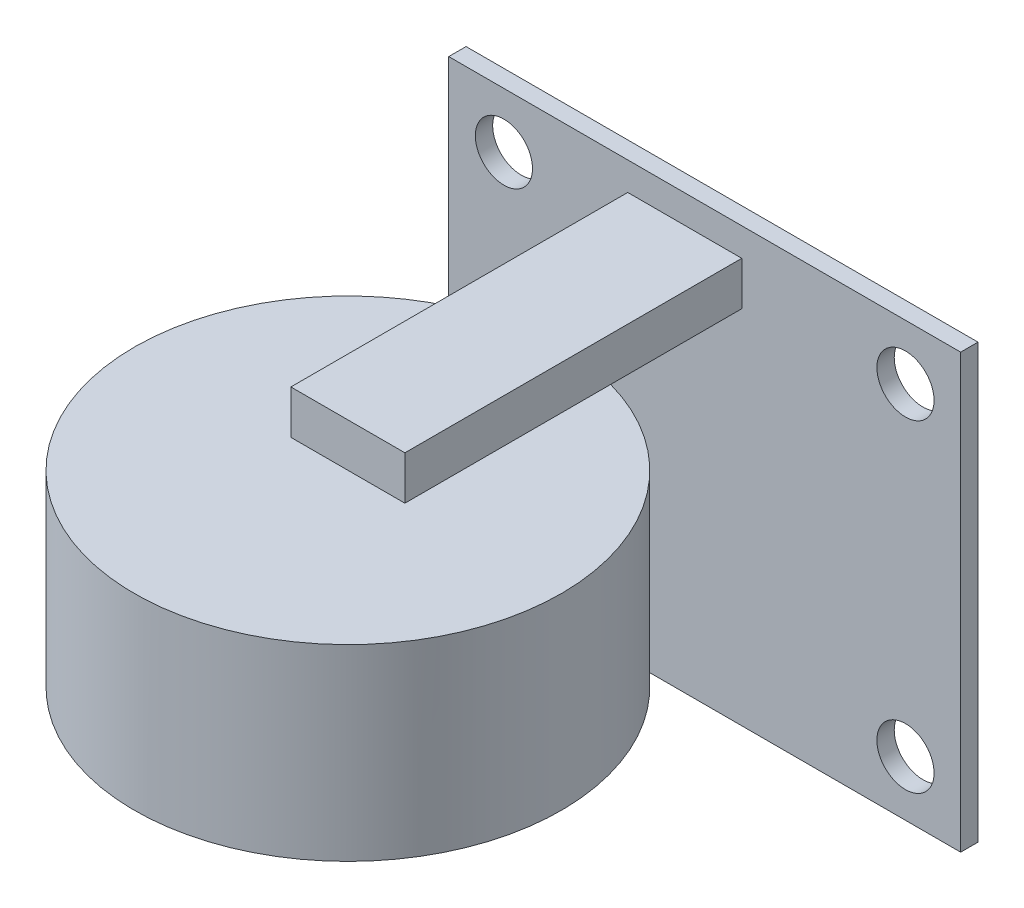
ISO-10303-21;
HEADER;
FILE_DESCRIPTION(('STEP AP214'),'2;1');
FILE_NAME('part.step','',(''),(''),'','','');
FILE_SCHEMA(('AUTOMOTIVE_DESIGN { 1 0 10303 214 1 1 1 1 }'));
ENDSEC;
DATA;
#1=APPLICATION_CONTEXT('core data for automotive mechanical design processes');
#2=APPLICATION_PROTOCOL_DEFINITION('international standard','automotive_design',2000,#1);
#3=PRODUCT_CONTEXT('',#1,'mechanical');
#4=PRODUCT('Part','Part','',(#3));
#5=PRODUCT_RELATED_PRODUCT_CATEGORY('part','',(#4));
#6=PRODUCT_DEFINITION_FORMATION('','',#4);
#7=PRODUCT_DEFINITION_CONTEXT('part definition',#1,'design');
#8=PRODUCT_DEFINITION('design','',#6,#7);
#9=PRODUCT_DEFINITION_SHAPE('','',#8);
#10=(LENGTH_UNIT() NAMED_UNIT(*) SI_UNIT(.MILLI.,.METRE.));
#11=(NAMED_UNIT(*) PLANE_ANGLE_UNIT() SI_UNIT($,.RADIAN.));
#12=(NAMED_UNIT(*) SI_UNIT($,.STERADIAN.) SOLID_ANGLE_UNIT());
#13=UNCERTAINTY_MEASURE_WITH_UNIT(LENGTH_MEASURE(1.E-05),#10,'distance_accuracy_value','');
#14=(GEOMETRIC_REPRESENTATION_CONTEXT(3) GLOBAL_UNCERTAINTY_ASSIGNED_CONTEXT((#13)) GLOBAL_UNIT_ASSIGNED_CONTEXT((#10,
#11,#12)) REPRESENTATION_CONTEXT('',''));
#15=CARTESIAN_POINT('',(0.,0.,0.));
#16=DIRECTION('',(0.,0.,1.));
#17=DIRECTION('',(1.,0.,0.));
#18=AXIS2_PLACEMENT_3D('',#15,#16,#17);
#19=CARTESIAN_POINT('',(15.7377658292148,31.756757303242,31.1404));
#20=DIRECTION('',(0.,1.,0.));
#21=DIRECTION('',(0.,0.,1.));
#22=AXIS2_PLACEMENT_3D('',#19,#20,#21);
#23=PLANE('',#22);
#24=CARTESIAN_POINT('',(20.7508458663312,31.756757303242,31.1404));
#25=DIRECTION('',(0.,-1.,0.));
#26=DIRECTION('',(0.,0.,-1.));
#27=AXIS2_PLACEMENT_3D('',#24,#25,#26);
#28=CIRCLE('',#27,18.7706);
#29=CARTESIAN_POINT('',(15.7377658292148,31.756757303242,13.0516064276949));
#30=VERTEX_POINT('',#29);
#31=CARTESIAN_POINT('',(25.7639259034477,31.756757303242,13.0516064276949));
#32=VERTEX_POINT('',#31);
#33=EDGE_CURVE('E106',#30,#32,#28,.T.);
#34=ORIENTED_EDGE('',*,*,#33,.F.);
#35=DIRECTION('',(0.,0.,-1.));
#36=VECTOR('',#35,1.);
#37=CARTESIAN_POINT('',(15.7377658292148,31.756757303242,31.1404));
#38=LINE('',#37,#36);
#39=CARTESIAN_POINT('',(15.7377658292148,31.756757303242,1.524));
#40=VERTEX_POINT('',#39);
#41=EDGE_CURVE('E47',#30,#40,#38,.T.);
#42=ORIENTED_EDGE('',*,*,#41,.T.);
#43=DIRECTION('',(1.,0.,0.));
#44=VECTOR('',#43,1.);
#45=CARTESIAN_POINT('',(15.7377658292148,31.756757303242,1.524));
#46=LINE('',#45,#44);
#47=CARTESIAN_POINT('',(25.7639259034477,31.756757303242,1.524));
#48=VERTEX_POINT('',#47);
#49=EDGE_CURVE('E118',#40,#48,#46,.T.);
#50=ORIENTED_EDGE('',*,*,#49,.T.);
#51=DIRECTION('',(0.,0.,-1.));
#52=VECTOR('',#51,1.);
#53=CARTESIAN_POINT('',(25.7639259034477,31.756757303242,31.1404));
#54=LINE('',#53,#52);
#55=EDGE_CURVE('E55',#32,#48,#54,.T.);
#56=ORIENTED_EDGE('',*,*,#55,.F.);
#57=EDGE_LOOP('',(#34,#42,#50,#56));
#58=FACE_BOUND('',#57,.T.);
#59=ADVANCED_FACE('F32',(#58),#23,.F.);
#60=CARTESIAN_POINT('',(0.,0.,1.524));
#61=DIRECTION('',(0.,0.,-1.));
#62=DIRECTION('',(-1.,0.,0.));
#63=AXIS2_PLACEMENT_3D('',#60,#61,#62);
#64=PLANE('',#63);
#65=CARTESIAN_POINT('',(40.1574,33.2232,1.524));
#66=DIRECTION('',(0.,0.,1.));
#67=DIRECTION('',(1.,0.,0.));
#68=AXIS2_PLACEMENT_3D('',#65,#66,#67);
#69=CIRCLE('',#68,2.5146);
#70=CARTESIAN_POINT('',(37.6428,33.2232,1.524));
#71=VERTEX_POINT('',#70);
#72=EDGE_CURVE('E130',#71,#71,#69,.T.);
#73=ORIENTED_EDGE('',*,*,#72,.F.);
#74=EDGE_LOOP('',(#73));
#75=FACE_BOUND('',#74,.T.);
#76=CARTESIAN_POINT('',(4.8514,4.8514,1.524));
#77=DIRECTION('',(0.,0.,1.));
#78=DIRECTION('',(1.,0.,0.));
#79=AXIS2_PLACEMENT_3D('',#76,#77,#78);
#80=CIRCLE('',#79,2.5146);
#81=CARTESIAN_POINT('',(2.3368,4.8514,1.524));
#82=VERTEX_POINT('',#81);
#83=EDGE_CURVE('E142',#82,#82,#80,.T.);
#84=ORIENTED_EDGE('',*,*,#83,.F.);
#85=EDGE_LOOP('',(#84));
#86=FACE_BOUND('',#85,.T.);
#87=DIRECTION('',(0.,-1.,0.));
#88=VECTOR('',#87,1.);
#89=CARTESIAN_POINT('',(0.,0.,1.524));
#90=LINE('',#89,#88);
#91=CARTESIAN_POINT('',(0.,38.0746,1.524));
#92=VERTEX_POINT('',#91);
#93=CARTESIAN_POINT('',(0.,0.,1.524));
#94=VERTEX_POINT('',#93);
#95=EDGE_CURVE('E154',#92,#94,#90,.T.);
#96=ORIENTED_EDGE('',*,*,#95,.T.);
#97=DIRECTION('',(1.,0.,0.));
#98=VECTOR('',#97,1.);
#99=CARTESIAN_POINT('',(0.,0.,1.524));
#100=LINE('',#99,#98);
#101=CARTESIAN_POINT('',(45.0088,0.,1.524));
#102=VERTEX_POINT('',#101);
#103=EDGE_CURVE('E157',#94,#102,#100,.T.);
#104=ORIENTED_EDGE('',*,*,#103,.T.);
#105=DIRECTION('',(0.,1.,0.));
#106=VECTOR('',#105,1.);
#107=CARTESIAN_POINT('',(45.0088,0.,1.524));
#108=LINE('',#107,#106);
#109=CARTESIAN_POINT('',(45.0088,38.0746,1.524));
#110=VERTEX_POINT('',#109);
#111=EDGE_CURVE('E160',#102,#110,#108,.T.);
#112=ORIENTED_EDGE('',*,*,#111,.T.);
#113=DIRECTION('',(-1.,0.,0.));
#114=VECTOR('',#113,1.);
#115=CARTESIAN_POINT('',(0.,38.0746,1.524));
#116=LINE('',#115,#114);
#117=EDGE_CURVE('E162',#110,#92,#116,.T.);
#118=ORIENTED_EDGE('',*,*,#117,.T.);
#119=EDGE_LOOP('',(#96,#104,#112,#118));
#120=FACE_BOUND('',#119,.T.);
#121=CARTESIAN_POINT('',(4.8514,33.2232,1.524));
#122=DIRECTION('',(0.,0.,1.));
#123=DIRECTION('',(1.,0.,0.));
#124=AXIS2_PLACEMENT_3D('',#121,#122,#123);
#125=CIRCLE('',#124,2.5146);
#126=CARTESIAN_POINT('',(2.3368,33.2232,1.524));
#127=VERTEX_POINT('',#126);
#128=EDGE_CURVE('E148',#127,#127,#125,.T.);
#129=ORIENTED_EDGE('',*,*,#128,.F.);
#130=EDGE_LOOP('',(#129));
#131=FACE_BOUND('',#130,.T.);
#132=CARTESIAN_POINT('',(40.1574,4.8514,1.524));
#133=DIRECTION('',(0.,0.,1.));
#134=DIRECTION('',(1.,0.,0.));
#135=AXIS2_PLACEMENT_3D('',#132,#133,#134);
#136=CIRCLE('',#135,2.5146);
#137=CARTESIAN_POINT('',(37.6428,4.8514,1.524));
#138=VERTEX_POINT('',#137);
#139=EDGE_CURVE('E136',#138,#138,#136,.T.);
#140=ORIENTED_EDGE('',*,*,#139,.F.);
#141=EDGE_LOOP('',(#140));
#142=FACE_BOUND('',#141,.T.);
#143=DIRECTION('',(0.,-1.,0.));
#144=VECTOR('',#143,1.);
#145=CARTESIAN_POINT('',(15.7377658292148,35.5959533961254,1.524));
#146=LINE('',#145,#144);
#147=CARTESIAN_POINT('',(15.7377658292148,35.5959533961254,1.524));
#148=VERTEX_POINT('',#147);
#149=EDGE_CURVE('E363',#148,#40,#146,.T.);
#150=ORIENTED_EDGE('',*,*,#149,.F.);
#151=DIRECTION('',(-1.,0.,0.));
#152=VECTOR('',#151,1.);
#153=CARTESIAN_POINT('',(15.7377658292148,35.5959533961254,1.524));
#154=LINE('',#153,#152);
#155=CARTESIAN_POINT('',(25.7639259034477,35.5959533961254,1.524));
#156=VERTEX_POINT('',#155);
#157=EDGE_CURVE('E372',#156,#148,#154,.T.);
#158=ORIENTED_EDGE('',*,*,#157,.F.);
#159=DIRECTION('',(0.,1.,0.));
#160=VECTOR('',#159,1.);
#161=CARTESIAN_POINT('',(25.7639259034477,35.5959533961254,1.524));
#162=LINE('',#161,#160);
#163=EDGE_CURVE('E379',#48,#156,#162,.T.);
#164=ORIENTED_EDGE('',*,*,#163,.F.);
#165=ORIENTED_EDGE('',*,*,#49,.F.);
#166=EDGE_LOOP('',(#150,#158,#164,#165));
#167=FACE_BOUND('',#166,.T.);
#168=ADVANCED_FACE('F197',(#75,#86,#120,#131,#142,#167),#64,.F.);
#169=CARTESIAN_POINT('',(0.,0.,0.));
#170=DIRECTION('',(0.,0.,-1.));
#171=DIRECTION('',(-1.,0.,0.));
#172=AXIS2_PLACEMENT_3D('',#169,#170,#171);
#173=PLANE('',#172);
#174=CARTESIAN_POINT('',(40.1574,4.8514,0.));
#175=DIRECTION('',(0.,0.,1.));
#176=DIRECTION('',(1.,0.,0.));
#177=AXIS2_PLACEMENT_3D('',#174,#175,#176);
#178=CIRCLE('',#177,2.5146);
#179=CARTESIAN_POINT('',(37.6428,4.8514,0.));
#180=VERTEX_POINT('',#179);
#181=EDGE_CURVE('E133',#180,#180,#178,.T.);
#182=ORIENTED_EDGE('',*,*,#181,.T.);
#183=EDGE_LOOP('',(#182));
#184=FACE_BOUND('',#183,.T.);
#185=CARTESIAN_POINT('',(4.8514,33.2232,0.));
#186=DIRECTION('',(0.,0.,1.));
#187=DIRECTION('',(1.,0.,0.));
#188=AXIS2_PLACEMENT_3D('',#185,#186,#187);
#189=CIRCLE('',#188,2.5146);
#190=CARTESIAN_POINT('',(2.3368,33.2232,0.));
#191=VERTEX_POINT('',#190);
#192=EDGE_CURVE('E145',#191,#191,#189,.T.);
#193=ORIENTED_EDGE('',*,*,#192,.T.);
#194=EDGE_LOOP('',(#193));
#195=FACE_BOUND('',#194,.T.);
#196=DIRECTION('',(0.,-1.,0.));
#197=VECTOR('',#196,1.);
#198=CARTESIAN_POINT('',(0.,0.,0.));
#199=LINE('',#198,#197);
#200=CARTESIAN_POINT('',(0.,38.0746,0.));
#201=VERTEX_POINT('',#200);
#202=CARTESIAN_POINT('',(0.,0.,0.));
#203=VERTEX_POINT('',#202);
#204=EDGE_CURVE('E151',#201,#203,#199,.T.);
#205=ORIENTED_EDGE('',*,*,#204,.F.);
#206=DIRECTION('',(-1.,0.,0.));
#207=VECTOR('',#206,1.);
#208=CARTESIAN_POINT('',(0.,38.0746,0.));
#209=LINE('',#208,#207);
#210=CARTESIAN_POINT('',(45.0088,38.0746,0.));
#211=VERTEX_POINT('',#210);
#212=EDGE_CURVE('E158',#211,#201,#209,.T.);
#213=ORIENTED_EDGE('',*,*,#212,.F.);
#214=DIRECTION('',(0.,1.,0.));
#215=VECTOR('',#214,1.);
#216=CARTESIAN_POINT('',(45.0088,0.,0.));
#217=LINE('',#216,#215);
#218=CARTESIAN_POINT('',(45.0088,0.,0.));
#219=VERTEX_POINT('',#218);
#220=EDGE_CURVE('E169',#219,#211,#217,.T.);
#221=ORIENTED_EDGE('',*,*,#220,.F.);
#222=DIRECTION('',(1.,0.,0.));
#223=VECTOR('',#222,1.);
#224=CARTESIAN_POINT('',(0.,0.,0.));
#225=LINE('',#224,#223);
#226=EDGE_CURVE('E167',#203,#219,#225,.T.);
#227=ORIENTED_EDGE('',*,*,#226,.F.);
#228=EDGE_LOOP('',(#205,#213,#221,#227));
#229=FACE_BOUND('',#228,.T.);
#230=CARTESIAN_POINT('',(4.8514,4.8514,0.));
#231=DIRECTION('',(0.,0.,1.));
#232=DIRECTION('',(1.,0.,0.));
#233=AXIS2_PLACEMENT_3D('',#230,#231,#232);
#234=CIRCLE('',#233,2.5146);
#235=CARTESIAN_POINT('',(2.3368,4.8514,0.));
#236=VERTEX_POINT('',#235);
#237=EDGE_CURVE('E139',#236,#236,#234,.T.);
#238=ORIENTED_EDGE('',*,*,#237,.T.);
#239=EDGE_LOOP('',(#238));
#240=FACE_BOUND('',#239,.T.);
#241=CARTESIAN_POINT('',(40.1574,33.2232,0.));
#242=DIRECTION('',(0.,0.,1.));
#243=DIRECTION('',(1.,0.,0.));
#244=AXIS2_PLACEMENT_3D('',#241,#242,#243);
#245=CIRCLE('',#244,2.5146);
#246=CARTESIAN_POINT('',(37.6428,33.2232,0.));
#247=VERTEX_POINT('',#246);
#248=EDGE_CURVE('E129',#247,#247,#245,.T.);
#249=ORIENTED_EDGE('',*,*,#248,.T.);
#250=EDGE_LOOP('',(#249));
#251=FACE_BOUND('',#250,.T.);
#252=ADVANCED_FACE('F187',(#184,#195,#229,#240,#251),#173,.T.);
#253=CARTESIAN_POINT('',(0.,0.,1.524));
#254=DIRECTION('',(1.,0.,0.));
#255=DIRECTION('',(0.,0.,-1.));
#256=AXIS2_PLACEMENT_3D('',#253,#254,#255);
#257=PLANE('',#256);
#258=ORIENTED_EDGE('',*,*,#204,.T.);
#259=DIRECTION('',(0.,0.,-1.));
#260=VECTOR('',#259,1.);
#261=CARTESIAN_POINT('',(0.,0.,1.524));
#262=LINE('',#261,#260);
#263=EDGE_CURVE('E11',#94,#203,#262,.T.);
#264=ORIENTED_EDGE('',*,*,#263,.F.);
#265=ORIENTED_EDGE('',*,*,#95,.F.);
#266=DIRECTION('',(0.,0.,-1.));
#267=VECTOR('',#266,1.);
#268=CARTESIAN_POINT('',(0.,38.0746,1.524));
#269=LINE('',#268,#267);
#270=EDGE_CURVE('E164',#92,#201,#269,.T.);
#271=ORIENTED_EDGE('',*,*,#270,.T.);
#272=EDGE_LOOP('',(#258,#264,#265,#271));
#273=FACE_BOUND('',#272,.T.);
#274=ADVANCED_FACE('F34',(#273),#257,.F.);
#275=CARTESIAN_POINT('',(0.,0.,1.524));
#276=DIRECTION('',(0.,1.,0.));
#277=DIRECTION('',(0.,0.,1.));
#278=AXIS2_PLACEMENT_3D('',#275,#276,#277);
#279=PLANE('',#278);
#280=ORIENTED_EDGE('',*,*,#226,.T.);
#281=DIRECTION('',(0.,0.,-1.));
#282=VECTOR('',#281,1.);
#283=CARTESIAN_POINT('',(45.0088,0.,1.524));
#284=LINE('',#283,#282);
#285=EDGE_CURVE('E40',#102,#219,#284,.T.);
#286=ORIENTED_EDGE('',*,*,#285,.F.);
#287=ORIENTED_EDGE('',*,*,#103,.F.);
#288=ORIENTED_EDGE('',*,*,#263,.T.);
#289=EDGE_LOOP('',(#280,#286,#287,#288));
#290=FACE_BOUND('',#289,.T.);
#291=ADVANCED_FACE('F199',(#290),#279,.F.);
#292=CARTESIAN_POINT('',(45.0088,0.,1.524));
#293=DIRECTION('',(-1.,0.,0.));
#294=DIRECTION('',(0.,-1.,0.));
#295=AXIS2_PLACEMENT_3D('',#292,#293,#294);
#296=PLANE('',#295);
#297=ORIENTED_EDGE('',*,*,#220,.T.);
#298=DIRECTION('',(0.,0.,-1.));
#299=VECTOR('',#298,1.);
#300=CARTESIAN_POINT('',(45.0088,38.0746,1.524));
#301=LINE('',#300,#299);
#302=EDGE_CURVE('E174',#110,#211,#301,.T.);
#303=ORIENTED_EDGE('',*,*,#302,.F.);
#304=ORIENTED_EDGE('',*,*,#111,.F.);
#305=ORIENTED_EDGE('',*,*,#285,.T.);
#306=EDGE_LOOP('',(#297,#303,#304,#305));
#307=FACE_BOUND('',#306,.T.);
#308=ADVANCED_FACE('F181',(#307),#296,.F.);
#309=CARTESIAN_POINT('',(0.,38.0746,1.524));
#310=DIRECTION('',(0.,-1.,0.));
#311=DIRECTION('',(0.,0.,-1.));
#312=AXIS2_PLACEMENT_3D('',#309,#310,#311);
#313=PLANE('',#312);
#314=ORIENTED_EDGE('',*,*,#212,.T.);
#315=ORIENTED_EDGE('',*,*,#270,.F.);
#316=ORIENTED_EDGE('',*,*,#117,.F.);
#317=ORIENTED_EDGE('',*,*,#302,.T.);
#318=EDGE_LOOP('',(#314,#315,#316,#317));
#319=FACE_BOUND('',#318,.T.);
#320=ADVANCED_FACE('F191',(#319),#313,.F.);
#321=CARTESIAN_POINT('',(4.8514,33.2232,1.524));
#322=DIRECTION('',(0.,0.,-1.));
#323=DIRECTION('',(-1.,0.,0.));
#324=AXIS2_PLACEMENT_3D('',#321,#322,#323);
#325=CYLINDRICAL_SURFACE('',#324,2.5146);
#326=CARTESIAN_POINT('',(2.3368,33.2232,1.524));
#327=CARTESIAN_POINT('',(2.3368,33.2232,1.508125));
#328=CARTESIAN_POINT('',(2.3368,33.2232,1.49225));
#329=CARTESIAN_POINT('',(2.3368,33.2232,1.4605));
#330=CARTESIAN_POINT('',(2.3368,33.2232,1.444625));
#331=CARTESIAN_POINT('',(2.3368,33.2232,1.412875));
#332=CARTESIAN_POINT('',(2.3368,33.2232,1.397));
#333=CARTESIAN_POINT('',(2.3368,33.2232,1.36525));
#334=CARTESIAN_POINT('',(2.3368,33.2232,1.349375));
#335=CARTESIAN_POINT('',(2.3368,33.2232,1.317625));
#336=CARTESIAN_POINT('',(2.3368,33.2232,1.30175));
#337=CARTESIAN_POINT('',(2.3368,33.2232,1.27));
#338=CARTESIAN_POINT('',(2.3368,33.2232,1.254125));
#339=CARTESIAN_POINT('',(2.3368,33.2232,1.222375));
#340=CARTESIAN_POINT('',(2.3368,33.2232,1.2065));
#341=CARTESIAN_POINT('',(2.3368,33.2232,1.17475));
#342=CARTESIAN_POINT('',(2.3368,33.2232,1.158875));
#343=CARTESIAN_POINT('',(2.3368,33.2232,1.127125));
#344=CARTESIAN_POINT('',(2.3368,33.2232,1.11125));
#345=CARTESIAN_POINT('',(2.3368,33.2232,1.0795));
#346=CARTESIAN_POINT('',(2.3368,33.2232,1.063625));
#347=CARTESIAN_POINT('',(2.3368,33.2232,1.031875));
#348=CARTESIAN_POINT('',(2.3368,33.2232,1.016));
#349=CARTESIAN_POINT('',(2.3368,33.2232,0.98425));
#350=CARTESIAN_POINT('',(2.3368,33.2232,0.968375));
#351=CARTESIAN_POINT('',(2.3368,33.2232,0.936625));
#352=CARTESIAN_POINT('',(2.3368,33.2232,0.92075));
#353=CARTESIAN_POINT('',(2.3368,33.2232,0.889));
#354=CARTESIAN_POINT('',(2.3368,33.2232,0.873125));
#355=CARTESIAN_POINT('',(2.3368,33.2232,0.841375));
#356=CARTESIAN_POINT('',(2.3368,33.2232,0.8255));
#357=CARTESIAN_POINT('',(2.3368,33.2232,0.79375));
#358=CARTESIAN_POINT('',(2.3368,33.2232,0.777875));
#359=CARTESIAN_POINT('',(2.3368,33.2232,0.746125));
#360=CARTESIAN_POINT('',(2.3368,33.2232,0.73025));
#361=CARTESIAN_POINT('',(2.3368,33.2232,0.6985));
#362=CARTESIAN_POINT('',(2.3368,33.2232,0.682625));
#363=CARTESIAN_POINT('',(2.3368,33.2232,0.650875));
#364=CARTESIAN_POINT('',(2.3368,33.2232,0.635));
#365=CARTESIAN_POINT('',(2.3368,33.2232,0.60325));
#366=CARTESIAN_POINT('',(2.3368,33.2232,0.587375));
#367=CARTESIAN_POINT('',(2.3368,33.2232,0.555625));
#368=CARTESIAN_POINT('',(2.3368,33.2232,0.53975));
#369=CARTESIAN_POINT('',(2.3368,33.2232,0.508));
#370=CARTESIAN_POINT('',(2.3368,33.2232,0.492125));
#371=CARTESIAN_POINT('',(2.3368,33.2232,0.460375));
#372=CARTESIAN_POINT('',(2.3368,33.2232,0.4445));
#373=CARTESIAN_POINT('',(2.3368,33.2232,0.41275));
#374=CARTESIAN_POINT('',(2.3368,33.2232,0.396875));
#375=CARTESIAN_POINT('',(2.3368,33.2232,0.365125));
#376=CARTESIAN_POINT('',(2.3368,33.2232,0.34925));
#377=CARTESIAN_POINT('',(2.3368,33.2232,0.3175));
#378=CARTESIAN_POINT('',(2.3368,33.2232,0.301625));
#379=CARTESIAN_POINT('',(2.3368,33.2232,0.269875));
#380=CARTESIAN_POINT('',(2.3368,33.2232,0.254));
#381=CARTESIAN_POINT('',(2.3368,33.2232,0.22225));
#382=CARTESIAN_POINT('',(2.3368,33.2232,0.206375));
#383=CARTESIAN_POINT('',(2.3368,33.2232,0.174625));
#384=CARTESIAN_POINT('',(2.3368,33.2232,0.15875));
#385=CARTESIAN_POINT('',(2.3368,33.2232,0.127));
#386=CARTESIAN_POINT('',(2.3368,33.2232,0.111125));
#387=CARTESIAN_POINT('',(2.3368,33.2232,0.079375));
#388=CARTESIAN_POINT('',(2.3368,33.2232,0.0635));
#389=CARTESIAN_POINT('',(2.3368,33.2232,0.0317499999999999));
#390=CARTESIAN_POINT('',(2.3368,33.2232,0.015875));
#391=CARTESIAN_POINT('',(2.3368,33.2232,0.));
#392=B_SPLINE_CURVE_WITH_KNOTS('',3,(#326,#327,#328,#329,#330,#331,#332,#333,#334,#335,#336,
#337,#338,#339,#340,#341,#342,#343,#344,#345,#346,#347,#348,#349,#350,#351,#352,#353,#354,#355,
#356,#357,#358,#359,#360,#361,#362,#363,#364,#365,#366,#367,#368,#369,#370,#371,#372,#373,#374,
#375,#376,#377,#378,#379,#380,#381,#382,#383,#384,#385,#386,#387,#388,#389,#390,#391),
.UNSPECIFIED.,.F.,.F.,(4,2,2,2,2,2,2,2,2,2,2,2,2,2,2,2,2,2,2,2,2,2,2,2,2,2,2,2,2,2,2,2,4),(0.,
0.0476249999999999,0.0952499999999998,0.142875,0.1905,0.238125,0.28575,0.333375,0.381,0.428625,
0.47625,0.523875,0.5715,0.619125,0.66675,0.714375,0.762,0.809625,0.85725,0.904875,0.9525,
1.000125,1.04775,1.095375,1.143,1.190625,1.23825,1.285875,1.3335,1.381125,1.42875,1.476375,
1.524),.UNSPECIFIED.);
#393=EDGE_CURVE('BSEAM231',#127,#191,#392,.T.);
#394=ORIENTED_EDGE('',*,*,#128,.T.);
#395=ORIENTED_EDGE('',*,*,#192,.F.);
#396=ORIENTED_EDGE('',*,*,#393,.T.);
#397=ORIENTED_EDGE('',*,*,#393,.F.);
#398=EDGE_LOOP('',(#394,#396,#395,#397));
#399=FACE_BOUND('',#398,.T.);
#400=ADVANCED_FACE('F231',(#399),#325,.F.);
#401=CARTESIAN_POINT('',(4.8514,4.8514,1.524));
#402=DIRECTION('',(0.,0.,-1.));
#403=DIRECTION('',(-1.,0.,0.));
#404=AXIS2_PLACEMENT_3D('',#401,#402,#403);
#405=CYLINDRICAL_SURFACE('',#404,2.5146);
#406=CARTESIAN_POINT('',(2.3368,4.8514,1.524));
#407=CARTESIAN_POINT('',(2.3368,4.8514,1.508125));
#408=CARTESIAN_POINT('',(2.3368,4.8514,1.49225));
#409=CARTESIAN_POINT('',(2.3368,4.8514,1.4605));
#410=CARTESIAN_POINT('',(2.3368,4.8514,1.444625));
#411=CARTESIAN_POINT('',(2.3368,4.8514,1.412875));
#412=CARTESIAN_POINT('',(2.3368,4.8514,1.397));
#413=CARTESIAN_POINT('',(2.3368,4.8514,1.36525));
#414=CARTESIAN_POINT('',(2.3368,4.8514,1.349375));
#415=CARTESIAN_POINT('',(2.3368,4.8514,1.317625));
#416=CARTESIAN_POINT('',(2.3368,4.8514,1.30175));
#417=CARTESIAN_POINT('',(2.3368,4.8514,1.27));
#418=CARTESIAN_POINT('',(2.3368,4.8514,1.254125));
#419=CARTESIAN_POINT('',(2.3368,4.8514,1.222375));
#420=CARTESIAN_POINT('',(2.3368,4.8514,1.2065));
#421=CARTESIAN_POINT('',(2.3368,4.8514,1.17475));
#422=CARTESIAN_POINT('',(2.3368,4.8514,1.158875));
#423=CARTESIAN_POINT('',(2.3368,4.8514,1.127125));
#424=CARTESIAN_POINT('',(2.3368,4.8514,1.11125));
#425=CARTESIAN_POINT('',(2.3368,4.8514,1.0795));
#426=CARTESIAN_POINT('',(2.3368,4.8514,1.063625));
#427=CARTESIAN_POINT('',(2.3368,4.8514,1.031875));
#428=CARTESIAN_POINT('',(2.3368,4.8514,1.016));
#429=CARTESIAN_POINT('',(2.3368,4.8514,0.98425));
#430=CARTESIAN_POINT('',(2.3368,4.8514,0.968375));
#431=CARTESIAN_POINT('',(2.3368,4.8514,0.936625));
#432=CARTESIAN_POINT('',(2.3368,4.8514,0.92075));
#433=CARTESIAN_POINT('',(2.3368,4.8514,0.889));
#434=CARTESIAN_POINT('',(2.3368,4.8514,0.873125));
#435=CARTESIAN_POINT('',(2.3368,4.8514,0.841375));
#436=CARTESIAN_POINT('',(2.3368,4.8514,0.8255));
#437=CARTESIAN_POINT('',(2.3368,4.8514,0.79375));
#438=CARTESIAN_POINT('',(2.3368,4.8514,0.777875));
#439=CARTESIAN_POINT('',(2.3368,4.8514,0.746125));
#440=CARTESIAN_POINT('',(2.3368,4.8514,0.73025));
#441=CARTESIAN_POINT('',(2.3368,4.8514,0.6985));
#442=CARTESIAN_POINT('',(2.3368,4.8514,0.682625));
#443=CARTESIAN_POINT('',(2.3368,4.8514,0.650875));
#444=CARTESIAN_POINT('',(2.3368,4.8514,0.635));
#445=CARTESIAN_POINT('',(2.3368,4.8514,0.60325));
#446=CARTESIAN_POINT('',(2.3368,4.8514,0.587375));
#447=CARTESIAN_POINT('',(2.3368,4.8514,0.555625));
#448=CARTESIAN_POINT('',(2.3368,4.8514,0.53975));
#449=CARTESIAN_POINT('',(2.3368,4.8514,0.508));
#450=CARTESIAN_POINT('',(2.3368,4.8514,0.492125));
#451=CARTESIAN_POINT('',(2.3368,4.8514,0.460375));
#452=CARTESIAN_POINT('',(2.3368,4.8514,0.4445));
#453=CARTESIAN_POINT('',(2.3368,4.8514,0.41275));
#454=CARTESIAN_POINT('',(2.3368,4.8514,0.396875));
#455=CARTESIAN_POINT('',(2.3368,4.8514,0.365125));
#456=CARTESIAN_POINT('',(2.3368,4.8514,0.34925));
#457=CARTESIAN_POINT('',(2.3368,4.8514,0.3175));
#458=CARTESIAN_POINT('',(2.3368,4.8514,0.301625));
#459=CARTESIAN_POINT('',(2.3368,4.8514,0.269875));
#460=CARTESIAN_POINT('',(2.3368,4.8514,0.254));
#461=CARTESIAN_POINT('',(2.3368,4.8514,0.22225));
#462=CARTESIAN_POINT('',(2.3368,4.8514,0.206375));
#463=CARTESIAN_POINT('',(2.3368,4.8514,0.174625));
#464=CARTESIAN_POINT('',(2.3368,4.8514,0.15875));
#465=CARTESIAN_POINT('',(2.3368,4.8514,0.127));
#466=CARTESIAN_POINT('',(2.3368,4.8514,0.111125));
#467=CARTESIAN_POINT('',(2.3368,4.8514,0.079375));
#468=CARTESIAN_POINT('',(2.3368,4.8514,0.0635));
#469=CARTESIAN_POINT('',(2.3368,4.8514,0.0317499999999999));
#470=CARTESIAN_POINT('',(2.3368,4.8514,0.015875));
#471=CARTESIAN_POINT('',(2.3368,4.8514,0.));
#472=B_SPLINE_CURVE_WITH_KNOTS('',3,(#406,#407,#408,#409,#410,#411,#412,#413,#414,#415,#416,
#417,#418,#419,#420,#421,#422,#423,#424,#425,#426,#427,#428,#429,#430,#431,#432,#433,#434,#435,
#436,#437,#438,#439,#440,#441,#442,#443,#444,#445,#446,#447,#448,#449,#450,#451,#452,#453,#454,
#455,#456,#457,#458,#459,#460,#461,#462,#463,#464,#465,#466,#467,#468,#469,#470,#471),
.UNSPECIFIED.,.F.,.F.,(4,2,2,2,2,2,2,2,2,2,2,2,2,2,2,2,2,2,2,2,2,2,2,2,2,2,2,2,2,2,2,2,4),(0.,
0.0476249999999999,0.0952499999999998,0.142875,0.1905,0.238125,0.28575,0.333375,0.381,0.428625,
0.47625,0.523875,0.5715,0.619125,0.66675,0.714375,0.762,0.809625,0.85725,0.904875,0.9525,
1.000125,1.04775,1.095375,1.143,1.190625,1.23825,1.285875,1.3335,1.381125,1.42875,1.476375,
1.524),.UNSPECIFIED.);
#473=EDGE_CURVE('BSEAM227',#82,#236,#472,.T.);
#474=ORIENTED_EDGE('',*,*,#83,.T.);
#475=ORIENTED_EDGE('',*,*,#237,.F.);
#476=ORIENTED_EDGE('',*,*,#473,.T.);
#477=ORIENTED_EDGE('',*,*,#473,.F.);
#478=EDGE_LOOP('',(#474,#476,#475,#477));
#479=FACE_BOUND('',#478,.T.);
#480=ADVANCED_FACE('F227',(#479),#405,.F.);
#481=CARTESIAN_POINT('',(40.1574,4.8514,1.524));
#482=DIRECTION('',(0.,0.,-1.));
#483=DIRECTION('',(-1.,0.,0.));
#484=AXIS2_PLACEMENT_3D('',#481,#482,#483);
#485=CYLINDRICAL_SURFACE('',#484,2.5146);
#486=CARTESIAN_POINT('',(37.6428,4.8514,1.524));
#487=CARTESIAN_POINT('',(37.6428,4.8514,1.508125));
#488=CARTESIAN_POINT('',(37.6428,4.8514,1.49225));
#489=CARTESIAN_POINT('',(37.6428,4.8514,1.4605));
#490=CARTESIAN_POINT('',(37.6428,4.8514,1.444625));
#491=CARTESIAN_POINT('',(37.6428,4.8514,1.412875));
#492=CARTESIAN_POINT('',(37.6428,4.8514,1.397));
#493=CARTESIAN_POINT('',(37.6428,4.8514,1.36525));
#494=CARTESIAN_POINT('',(37.6428,4.8514,1.349375));
#495=CARTESIAN_POINT('',(37.6428,4.8514,1.317625));
#496=CARTESIAN_POINT('',(37.6428,4.8514,1.30175));
#497=CARTESIAN_POINT('',(37.6428,4.8514,1.27));
#498=CARTESIAN_POINT('',(37.6428,4.8514,1.254125));
#499=CARTESIAN_POINT('',(37.6428,4.8514,1.222375));
#500=CARTESIAN_POINT('',(37.6428,4.8514,1.2065));
#501=CARTESIAN_POINT('',(37.6428,4.8514,1.17475));
#502=CARTESIAN_POINT('',(37.6428,4.8514,1.158875));
#503=CARTESIAN_POINT('',(37.6428,4.8514,1.127125));
#504=CARTESIAN_POINT('',(37.6428,4.8514,1.11125));
#505=CARTESIAN_POINT('',(37.6428,4.8514,1.0795));
#506=CARTESIAN_POINT('',(37.6428,4.8514,1.063625));
#507=CARTESIAN_POINT('',(37.6428,4.8514,1.031875));
#508=CARTESIAN_POINT('',(37.6428,4.8514,1.016));
#509=CARTESIAN_POINT('',(37.6428,4.8514,0.98425));
#510=CARTESIAN_POINT('',(37.6428,4.8514,0.968375));
#511=CARTESIAN_POINT('',(37.6428,4.8514,0.936625));
#512=CARTESIAN_POINT('',(37.6428,4.8514,0.92075));
#513=CARTESIAN_POINT('',(37.6428,4.8514,0.889));
#514=CARTESIAN_POINT('',(37.6428,4.8514,0.873125));
#515=CARTESIAN_POINT('',(37.6428,4.8514,0.841375));
#516=CARTESIAN_POINT('',(37.6428,4.8514,0.8255));
#517=CARTESIAN_POINT('',(37.6428,4.8514,0.79375));
#518=CARTESIAN_POINT('',(37.6428,4.8514,0.777875));
#519=CARTESIAN_POINT('',(37.6428,4.8514,0.746125));
#520=CARTESIAN_POINT('',(37.6428,4.8514,0.73025));
#521=CARTESIAN_POINT('',(37.6428,4.8514,0.6985));
#522=CARTESIAN_POINT('',(37.6428,4.8514,0.682625));
#523=CARTESIAN_POINT('',(37.6428,4.8514,0.650875));
#524=CARTESIAN_POINT('',(37.6428,4.8514,0.635));
#525=CARTESIAN_POINT('',(37.6428,4.8514,0.60325));
#526=CARTESIAN_POINT('',(37.6428,4.8514,0.587375));
#527=CARTESIAN_POINT('',(37.6428,4.8514,0.555625));
#528=CARTESIAN_POINT('',(37.6428,4.8514,0.53975));
#529=CARTESIAN_POINT('',(37.6428,4.8514,0.508));
#530=CARTESIAN_POINT('',(37.6428,4.8514,0.492125));
#531=CARTESIAN_POINT('',(37.6428,4.8514,0.460375));
#532=CARTESIAN_POINT('',(37.6428,4.8514,0.4445));
#533=CARTESIAN_POINT('',(37.6428,4.8514,0.41275));
#534=CARTESIAN_POINT('',(37.6428,4.8514,0.396875));
#535=CARTESIAN_POINT('',(37.6428,4.8514,0.365125));
#536=CARTESIAN_POINT('',(37.6428,4.8514,0.34925));
#537=CARTESIAN_POINT('',(37.6428,4.8514,0.3175));
#538=CARTESIAN_POINT('',(37.6428,4.8514,0.301625));
#539=CARTESIAN_POINT('',(37.6428,4.8514,0.269875));
#540=CARTESIAN_POINT('',(37.6428,4.8514,0.254));
#541=CARTESIAN_POINT('',(37.6428,4.8514,0.22225));
#542=CARTESIAN_POINT('',(37.6428,4.8514,0.206375));
#543=CARTESIAN_POINT('',(37.6428,4.8514,0.174625));
#544=CARTESIAN_POINT('',(37.6428,4.8514,0.15875));
#545=CARTESIAN_POINT('',(37.6428,4.8514,0.127));
#546=CARTESIAN_POINT('',(37.6428,4.8514,0.111125));
#547=CARTESIAN_POINT('',(37.6428,4.8514,0.079375));
#548=CARTESIAN_POINT('',(37.6428,4.8514,0.0635));
#549=CARTESIAN_POINT('',(37.6428,4.8514,0.0317499999999999));
#550=CARTESIAN_POINT('',(37.6428,4.8514,0.015875));
#551=CARTESIAN_POINT('',(37.6428,4.8514,0.));
#552=B_SPLINE_CURVE_WITH_KNOTS('',3,(#486,#487,#488,#489,#490,#491,#492,#493,#494,#495,#496,
#497,#498,#499,#500,#501,#502,#503,#504,#505,#506,#507,#508,#509,#510,#511,#512,#513,#514,#515,
#516,#517,#518,#519,#520,#521,#522,#523,#524,#525,#526,#527,#528,#529,#530,#531,#532,#533,#534,
#535,#536,#537,#538,#539,#540,#541,#542,#543,#544,#545,#546,#547,#548,#549,#550,#551),
.UNSPECIFIED.,.F.,.F.,(4,2,2,2,2,2,2,2,2,2,2,2,2,2,2,2,2,2,2,2,2,2,2,2,2,2,2,2,2,2,2,2,4),(0.,
0.0476249999999999,0.0952499999999998,0.142875,0.1905,0.238125,0.28575,0.333375,0.381,0.428625,
0.47625,0.523875,0.5715,0.619125,0.66675,0.714375,0.762,0.809625,0.85725,0.904875,0.9525,
1.000125,1.04775,1.095375,1.143,1.190625,1.23825,1.285875,1.3335,1.381125,1.42875,1.476375,
1.524),.UNSPECIFIED.);
#553=EDGE_CURVE('BSEAM223',#138,#180,#552,.T.);
#554=ORIENTED_EDGE('',*,*,#139,.T.);
#555=ORIENTED_EDGE('',*,*,#181,.F.);
#556=ORIENTED_EDGE('',*,*,#553,.T.);
#557=ORIENTED_EDGE('',*,*,#553,.F.);
#558=EDGE_LOOP('',(#554,#556,#555,#557));
#559=FACE_BOUND('',#558,.T.);
#560=ADVANCED_FACE('F223',(#559),#485,.F.);
#561=CARTESIAN_POINT('',(40.1574,33.2232,1.524));
#562=DIRECTION('',(0.,0.,-1.));
#563=DIRECTION('',(-1.,0.,0.));
#564=AXIS2_PLACEMENT_3D('',#561,#562,#563);
#565=CYLINDRICAL_SURFACE('',#564,2.5146);
#566=CARTESIAN_POINT('',(37.6428,33.2232,1.524));
#567=CARTESIAN_POINT('',(37.6428,33.2232,1.508125));
#568=CARTESIAN_POINT('',(37.6428,33.2232,1.49225));
#569=CARTESIAN_POINT('',(37.6428,33.2232,1.4605));
#570=CARTESIAN_POINT('',(37.6428,33.2232,1.444625));
#571=CARTESIAN_POINT('',(37.6428,33.2232,1.412875));
#572=CARTESIAN_POINT('',(37.6428,33.2232,1.397));
#573=CARTESIAN_POINT('',(37.6428,33.2232,1.36525));
#574=CARTESIAN_POINT('',(37.6428,33.2232,1.349375));
#575=CARTESIAN_POINT('',(37.6428,33.2232,1.317625));
#576=CARTESIAN_POINT('',(37.6428,33.2232,1.30175));
#577=CARTESIAN_POINT('',(37.6428,33.2232,1.27));
#578=CARTESIAN_POINT('',(37.6428,33.2232,1.254125));
#579=CARTESIAN_POINT('',(37.6428,33.2232,1.222375));
#580=CARTESIAN_POINT('',(37.6428,33.2232,1.2065));
#581=CARTESIAN_POINT('',(37.6428,33.2232,1.17475));
#582=CARTESIAN_POINT('',(37.6428,33.2232,1.158875));
#583=CARTESIAN_POINT('',(37.6428,33.2232,1.127125));
#584=CARTESIAN_POINT('',(37.6428,33.2232,1.11125));
#585=CARTESIAN_POINT('',(37.6428,33.2232,1.0795));
#586=CARTESIAN_POINT('',(37.6428,33.2232,1.063625));
#587=CARTESIAN_POINT('',(37.6428,33.2232,1.031875));
#588=CARTESIAN_POINT('',(37.6428,33.2232,1.016));
#589=CARTESIAN_POINT('',(37.6428,33.2232,0.98425));
#590=CARTESIAN_POINT('',(37.6428,33.2232,0.968375));
#591=CARTESIAN_POINT('',(37.6428,33.2232,0.936625));
#592=CARTESIAN_POINT('',(37.6428,33.2232,0.92075));
#593=CARTESIAN_POINT('',(37.6428,33.2232,0.889));
#594=CARTESIAN_POINT('',(37.6428,33.2232,0.873125));
#595=CARTESIAN_POINT('',(37.6428,33.2232,0.841375));
#596=CARTESIAN_POINT('',(37.6428,33.2232,0.8255));
#597=CARTESIAN_POINT('',(37.6428,33.2232,0.79375));
#598=CARTESIAN_POINT('',(37.6428,33.2232,0.777875));
#599=CARTESIAN_POINT('',(37.6428,33.2232,0.746125));
#600=CARTESIAN_POINT('',(37.6428,33.2232,0.73025));
#601=CARTESIAN_POINT('',(37.6428,33.2232,0.6985));
#602=CARTESIAN_POINT('',(37.6428,33.2232,0.682625));
#603=CARTESIAN_POINT('',(37.6428,33.2232,0.650875));
#604=CARTESIAN_POINT('',(37.6428,33.2232,0.635));
#605=CARTESIAN_POINT('',(37.6428,33.2232,0.60325));
#606=CARTESIAN_POINT('',(37.6428,33.2232,0.587375));
#607=CARTESIAN_POINT('',(37.6428,33.2232,0.555625));
#608=CARTESIAN_POINT('',(37.6428,33.2232,0.53975));
#609=CARTESIAN_POINT('',(37.6428,33.2232,0.508));
#610=CARTESIAN_POINT('',(37.6428,33.2232,0.492125));
#611=CARTESIAN_POINT('',(37.6428,33.2232,0.460375));
#612=CARTESIAN_POINT('',(37.6428,33.2232,0.4445));
#613=CARTESIAN_POINT('',(37.6428,33.2232,0.41275));
#614=CARTESIAN_POINT('',(37.6428,33.2232,0.396875));
#615=CARTESIAN_POINT('',(37.6428,33.2232,0.365125));
#616=CARTESIAN_POINT('',(37.6428,33.2232,0.34925));
#617=CARTESIAN_POINT('',(37.6428,33.2232,0.3175));
#618=CARTESIAN_POINT('',(37.6428,33.2232,0.301625));
#619=CARTESIAN_POINT('',(37.6428,33.2232,0.269875));
#620=CARTESIAN_POINT('',(37.6428,33.2232,0.254));
#621=CARTESIAN_POINT('',(37.6428,33.2232,0.22225));
#622=CARTESIAN_POINT('',(37.6428,33.2232,0.206375));
#623=CARTESIAN_POINT('',(37.6428,33.2232,0.174625));
#624=CARTESIAN_POINT('',(37.6428,33.2232,0.15875));
#625=CARTESIAN_POINT('',(37.6428,33.2232,0.127));
#626=CARTESIAN_POINT('',(37.6428,33.2232,0.111125));
#627=CARTESIAN_POINT('',(37.6428,33.2232,0.079375));
#628=CARTESIAN_POINT('',(37.6428,33.2232,0.0635));
#629=CARTESIAN_POINT('',(37.6428,33.2232,0.0317499999999999));
#630=CARTESIAN_POINT('',(37.6428,33.2232,0.015875));
#631=CARTESIAN_POINT('',(37.6428,33.2232,0.));
#632=B_SPLINE_CURVE_WITH_KNOTS('',3,(#566,#567,#568,#569,#570,#571,#572,#573,#574,#575,#576,
#577,#578,#579,#580,#581,#582,#583,#584,#585,#586,#587,#588,#589,#590,#591,#592,#593,#594,#595,
#596,#597,#598,#599,#600,#601,#602,#603,#604,#605,#606,#607,#608,#609,#610,#611,#612,#613,#614,
#615,#616,#617,#618,#619,#620,#621,#622,#623,#624,#625,#626,#627,#628,#629,#630,#631),
.UNSPECIFIED.,.F.,.F.,(4,2,2,2,2,2,2,2,2,2,2,2,2,2,2,2,2,2,2,2,2,2,2,2,2,2,2,2,2,2,2,2,4),(0.,
0.0476249999999999,0.0952499999999998,0.142875,0.1905,0.238125,0.28575,0.333375,0.381,0.428625,
0.47625,0.523875,0.5715,0.619125,0.66675,0.714375,0.762,0.809625,0.85725,0.904875,0.9525,
1.000125,1.04775,1.095375,1.143,1.190625,1.23825,1.285875,1.3335,1.381125,1.42875,1.476375,
1.524),.UNSPECIFIED.);
#633=EDGE_CURVE('BSEAM219',#71,#247,#632,.T.);
#634=ORIENTED_EDGE('',*,*,#72,.T.);
#635=ORIENTED_EDGE('',*,*,#248,.F.);
#636=ORIENTED_EDGE('',*,*,#633,.T.);
#637=ORIENTED_EDGE('',*,*,#633,.F.);
#638=EDGE_LOOP('',(#634,#636,#635,#637));
#639=FACE_BOUND('',#638,.T.);
#640=ADVANCED_FACE('F219',(#639),#565,.F.);
#641=CARTESIAN_POINT('',(15.7377658292148,35.5959533961254,31.1404));
#642=DIRECTION('',(1.,0.,0.));
#643=DIRECTION('',(0.,0.,-1.));
#644=AXIS2_PLACEMENT_3D('',#641,#642,#643);
#645=PLANE('',#644);
#646=ORIENTED_EDGE('',*,*,#149,.T.);
#647=ORIENTED_EDGE('',*,*,#41,.F.);
#648=CARTESIAN_POINT('',(15.7377658292148,31.756757303242,31.1404));
#649=VERTEX_POINT('',#648);
#650=EDGE_CURVE('E116',#649,#30,#38,.T.);
#651=ORIENTED_EDGE('',*,*,#650,.F.);
#652=DIRECTION('',(0.,-1.,0.));
#653=VECTOR('',#652,1.);
#654=CARTESIAN_POINT('',(15.7377658292148,35.5959533961254,31.1404));
#655=LINE('',#654,#653);
#656=CARTESIAN_POINT('',(15.7377658292148,35.5959533961254,31.1404));
#657=VERTEX_POINT('',#656);
#658=EDGE_CURVE('E368',#657,#649,#655,.T.);
#659=ORIENTED_EDGE('',*,*,#658,.F.);
#660=DIRECTION('',(0.,0.,-1.));
#661=VECTOR('',#660,1.);
#662=CARTESIAN_POINT('',(15.7377658292148,35.5959533961254,31.1404));
#663=LINE('',#662,#661);
#664=EDGE_CURVE('E376',#657,#148,#663,.T.);
#665=ORIENTED_EDGE('',*,*,#664,.T.);
#666=EDGE_LOOP('',(#646,#647,#651,#659,#665));
#667=FACE_BOUND('',#666,.T.);
#668=ADVANCED_FACE('F216',(#667),#645,.F.);
#669=CARTESIAN_POINT('',(25.7639259034477,35.5959533961254,31.1404));
#670=DIRECTION('',(-1.,0.,0.));
#671=DIRECTION('',(0.,0.,1.));
#672=AXIS2_PLACEMENT_3D('',#669,#670,#671);
#673=PLANE('',#672);
#674=ORIENTED_EDGE('',*,*,#163,.T.);
#675=DIRECTION('',(0.,0.,-1.));
#676=VECTOR('',#675,1.);
#677=CARTESIAN_POINT('',(25.7639259034477,35.5959533961254,31.1404));
#678=LINE('',#677,#676);
#679=CARTESIAN_POINT('',(25.7639259034477,35.5959533961254,31.1404));
#680=VERTEX_POINT('',#679);
#681=EDGE_CURVE('E119',#680,#156,#678,.T.);
#682=ORIENTED_EDGE('',*,*,#681,.F.);
#683=DIRECTION('',(0.,1.,0.));
#684=VECTOR('',#683,1.);
#685=CARTESIAN_POINT('',(25.7639259034477,35.5959533961254,31.1404));
#686=LINE('',#685,#684);
#687=CARTESIAN_POINT('',(25.7639259034477,31.756757303242,31.1404));
#688=VERTEX_POINT('',#687);
#689=EDGE_CURVE('E124',#688,#680,#686,.T.);
#690=ORIENTED_EDGE('',*,*,#689,.F.);
#691=EDGE_CURVE('E113',#688,#32,#54,.T.);
#692=ORIENTED_EDGE('',*,*,#691,.T.);
#693=ORIENTED_EDGE('',*,*,#55,.T.);
#694=EDGE_LOOP('',(#674,#682,#690,#692,#693));
#695=FACE_BOUND('',#694,.T.);
#696=ADVANCED_FACE('F122',(#695),#673,.F.);
#697=CARTESIAN_POINT('',(15.7377658292148,35.5959533961254,31.1404));
#698=DIRECTION('',(0.,-1.,0.));
#699=DIRECTION('',(0.,0.,-1.));
#700=AXIS2_PLACEMENT_3D('',#697,#698,#699);
#701=PLANE('',#700);
#702=ORIENTED_EDGE('',*,*,#157,.T.);
#703=ORIENTED_EDGE('',*,*,#664,.F.);
#704=DIRECTION('',(-1.,0.,0.));
#705=VECTOR('',#704,1.);
#706=CARTESIAN_POINT('',(15.7377658292148,35.5959533961254,31.1404));
#707=LINE('',#706,#705);
#708=EDGE_CURVE('E375',#680,#657,#707,.T.);
#709=ORIENTED_EDGE('',*,*,#708,.F.);
#710=ORIENTED_EDGE('',*,*,#681,.T.);
#711=EDGE_LOOP('',(#702,#703,#709,#710));
#712=FACE_BOUND('',#711,.T.);
#713=ADVANCED_FACE('F271',(#712),#701,.F.);
#714=CARTESIAN_POINT('',(0.,0.,31.1404));
#715=DIRECTION('',(0.,0.,1.));
#716=DIRECTION('',(1.,0.,0.));
#717=AXIS2_PLACEMENT_3D('',#714,#715,#716);
#718=PLANE('',#717);
#719=ORIENTED_EDGE('',*,*,#658,.T.);
#720=DIRECTION('',(1.,0.,0.));
#721=VECTOR('',#720,1.);
#722=CARTESIAN_POINT('',(15.7377658292148,31.756757303242,31.1404));
#723=LINE('',#722,#721);
#724=EDGE_CURVE('E371',#649,#688,#723,.T.);
#725=ORIENTED_EDGE('',*,*,#724,.T.);
#726=ORIENTED_EDGE('',*,*,#689,.T.);
#727=ORIENTED_EDGE('',*,*,#708,.T.);
#728=EDGE_LOOP('',(#719,#725,#726,#727));
#729=FACE_BOUND('',#728,.T.);
#730=ADVANCED_FACE('F278',(#729),#718,.T.);
#731=CARTESIAN_POINT('',(20.7508458663312,31.756757303242,31.1404));
#732=DIRECTION('',(0.,-1.,0.));
#733=DIRECTION('',(0.,0.,-1.));
#734=AXIS2_PLACEMENT_3D('',#731,#732,#733);
#735=PLANE('',#734);
#736=ORIENTED_EDGE('',*,*,#724,.F.);
#737=ORIENTED_EDGE('',*,*,#650,.T.);
#738=EDGE_CURVE('E109',#32,#30,#28,.T.);
#739=ORIENTED_EDGE('',*,*,#738,.F.);
#740=ORIENTED_EDGE('',*,*,#691,.F.);
#741=EDGE_LOOP('',(#736,#737,#739,#740));
#742=FACE_BOUND('',#741,.T.);
#743=ADVANCED_FACE('F112',(#742),#735,.F.);
#744=CARTESIAN_POINT('',(20.7508458663312,15.246757303242,31.1404));
#745=DIRECTION('',(0.,1.,0.));
#746=DIRECTION('',(0.,0.,1.));
#747=AXIS2_PLACEMENT_3D('',#744,#745,#746);
#748=CYLINDRICAL_SURFACE('',#747,18.7706);
#749=CARTESIAN_POINT('',(20.7508458663312,15.246757303242,31.1404));
#750=DIRECTION('',(0.,-1.,0.));
#751=DIRECTION('',(0.,0.,-1.));
#752=AXIS2_PLACEMENT_3D('',#749,#750,#751);
#753=CIRCLE('',#752,18.7706);
#754=CARTESIAN_POINT('',(20.7508458663312,15.246757303242,12.3698));
#755=VERTEX_POINT('',#754);
#756=EDGE_CURVE('E117',#755,#755,#753,.T.);
#757=ORIENTED_EDGE('',*,*,#756,.F.);
#758=EDGE_LOOP('',(#757));
#759=FACE_BOUND('',#758,.T.);
#760=ORIENTED_EDGE('',*,*,#738,.T.);
#761=ORIENTED_EDGE('',*,*,#33,.T.);
#762=EDGE_LOOP('',(#760,#761));
#763=FACE_BOUND('',#762,.T.);
#764=ADVANCED_FACE('F108',(#759,#763),#748,.T.);
#765=CARTESIAN_POINT('',(20.7508458663312,15.246757303242,31.1404));
#766=DIRECTION('',(0.,-1.,0.));
#767=DIRECTION('',(0.,0.,-1.));
#768=AXIS2_PLACEMENT_3D('',#765,#766,#767);
#769=PLANE('',#768);
#770=ORIENTED_EDGE('',*,*,#756,.T.);
#771=EDGE_LOOP('',(#770));
#772=FACE_BOUND('',#771,.T.);
#773=ADVANCED_FACE('F297',(#772),#769,.T.);
#774=CLOSED_SHELL('',(#59,#168,#252,#274,#291,#308,#320,#400,#480,#560,#640,#668,#696,#713,#730,
#743,#764,#773));
#775=MANIFOLD_SOLID_BREP('B2',#774);
#776=ADVANCED_BREP_SHAPE_REPRESENTATION('',(#18,#775),#14);
#777=SHAPE_DEFINITION_REPRESENTATION(#9,#776);
ENDSEC;
END-ISO-10303-21;
